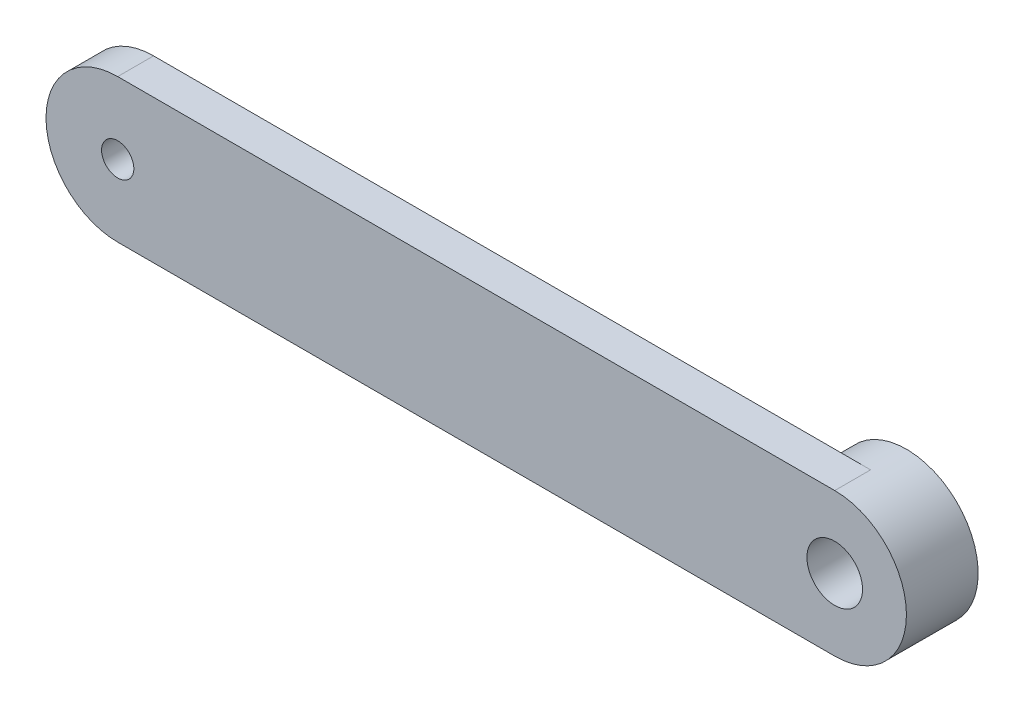
ISO-10303-21;
HEADER;
FILE_DESCRIPTION(('STEP AP214'),'2;1');
FILE_NAME('part.step','',(''),(''),'','','');
FILE_SCHEMA(('AUTOMOTIVE_DESIGN { 1 0 10303 214 1 1 1 1 }'));
ENDSEC;
DATA;
#1=APPLICATION_CONTEXT('core data for automotive mechanical design processes');
#2=APPLICATION_PROTOCOL_DEFINITION('international standard','automotive_design',2000,#1);
#3=PRODUCT_CONTEXT('',#1,'mechanical');
#4=PRODUCT('Part','Part','',(#3));
#5=PRODUCT_RELATED_PRODUCT_CATEGORY('part','',(#4));
#6=PRODUCT_DEFINITION_FORMATION('','',#4);
#7=PRODUCT_DEFINITION_CONTEXT('part definition',#1,'design');
#8=PRODUCT_DEFINITION('design','',#6,#7);
#9=PRODUCT_DEFINITION_SHAPE('','',#8);
#10=(LENGTH_UNIT() NAMED_UNIT(*) SI_UNIT(.MILLI.,.METRE.));
#11=(NAMED_UNIT(*) PLANE_ANGLE_UNIT() SI_UNIT($,.RADIAN.));
#12=(NAMED_UNIT(*) SI_UNIT($,.STERADIAN.) SOLID_ANGLE_UNIT());
#13=UNCERTAINTY_MEASURE_WITH_UNIT(LENGTH_MEASURE(1.E-05),#10,'distance_accuracy_value','');
#14=(GEOMETRIC_REPRESENTATION_CONTEXT(3) GLOBAL_UNCERTAINTY_ASSIGNED_CONTEXT((#13)) GLOBAL_UNIT_ASSIGNED_CONTEXT((#10,
#11,#12)) REPRESENTATION_CONTEXT('',''));
#15=CARTESIAN_POINT('',(0.,0.,0.));
#16=DIRECTION('',(0.,0.,1.));
#17=DIRECTION('',(1.,0.,0.));
#18=AXIS2_PLACEMENT_3D('',#15,#16,#17);
#19=CARTESIAN_POINT('',(20.,0.,0.));
#20=DIRECTION('',(0.,0.,1.));
#21=DIRECTION('',(1.,0.,0.));
#22=AXIS2_PLACEMENT_3D('',#19,#20,#21);
#23=PLANE('',#22);
#24=CARTESIAN_POINT('',(-20.,0.,0.));
#25=DIRECTION('',(0.,0.,1.));
#26=DIRECTION('',(1.,0.,0.));
#27=AXIS2_PLACEMENT_3D('',#24,#25,#26);
#28=CIRCLE('',#27,2.);
#29=CARTESIAN_POINT('',(-18.,0.,0.));
#30=VERTEX_POINT('',#29);
#31=EDGE_CURVE('E12',#30,#30,#28,.F.);
#32=ORIENTED_EDGE('',*,*,#31,.F.);
#33=EDGE_LOOP('',(#32));
#34=FACE_BOUND('',#33,.T.);
#35=CARTESIAN_POINT('',(20.,0.,0.));
#36=DIRECTION('',(0.,0.,-1.));
#37=DIRECTION('',(-1.,0.,0.));
#38=AXIS2_PLACEMENT_3D('',#35,#36,#37);
#39=CIRCLE('',#38,4.);
#40=CARTESIAN_POINT('',(20.,-3.99999999999999,0.));
#41=VERTEX_POINT('',#40);
#42=CARTESIAN_POINT('',(20.,4.00000000000001,0.));
#43=VERTEX_POINT('',#42);
#44=EDGE_CURVE('E89',#41,#43,#39,.T.);
#45=ORIENTED_EDGE('',*,*,#44,.F.);
#46=DIRECTION('',(1.,0.,0.));
#47=VECTOR('',#46,1.);
#48=CARTESIAN_POINT('',(20.,-3.99999999999999,0.));
#49=LINE('',#48,#47);
#50=CARTESIAN_POINT('',(-20.,-4.00000000000001,0.));
#51=VERTEX_POINT('',#50);
#52=EDGE_CURVE('E91',#51,#41,#49,.T.);
#53=ORIENTED_EDGE('',*,*,#52,.F.);
#54=CARTESIAN_POINT('',(-20.,0.,0.));
#55=DIRECTION('',(0.,0.,1.));
#56=DIRECTION('',(1.,0.,0.));
#57=AXIS2_PLACEMENT_3D('',#54,#55,#56);
#58=CIRCLE('',#57,4.);
#59=CARTESIAN_POINT('',(-20.,4.,0.));
#60=VERTEX_POINT('',#59);
#61=EDGE_CURVE('E79',#60,#51,#58,.T.);
#62=ORIENTED_EDGE('',*,*,#61,.F.);
#63=DIRECTION('',(-1.,0.,0.));
#64=VECTOR('',#63,1.);
#65=CARTESIAN_POINT('',(20.,4.00000000000001,0.));
#66=LINE('',#65,#64);
#67=EDGE_CURVE('E72',#43,#60,#66,.T.);
#68=ORIENTED_EDGE('',*,*,#67,.F.);
#69=EDGE_LOOP('',(#45,#53,#62,#68));
#70=FACE_BOUND('',#69,.T.);
#71=ADVANCED_FACE('F40',(#34,#70),#23,.F.);
#72=CARTESIAN_POINT('',(20.,0.,2.));
#73=DIRECTION('',(0.,0.,1.));
#74=DIRECTION('',(1.,0.,0.));
#75=AXIS2_PLACEMENT_3D('',#72,#73,#74);
#76=PLANE('',#75);
#77=CARTESIAN_POINT('',(20.,0.,2.));
#78=DIRECTION('',(0.,0.,1.));
#79=DIRECTION('',(1.,0.,0.));
#80=AXIS2_PLACEMENT_3D('',#77,#78,#79);
#81=CIRCLE('',#80,1.55);
#82=CARTESIAN_POINT('',(21.55,0.,2.));
#83=VERTEX_POINT('',#82);
#84=EDGE_CURVE('E178',#83,#83,#81,.T.);
#85=ORIENTED_EDGE('',*,*,#84,.F.);
#86=EDGE_LOOP('',(#85));
#87=FACE_BOUND('',#86,.T.);
#88=CARTESIAN_POINT('',(20.,0.,2.));
#89=DIRECTION('',(0.,0.,1.));
#90=DIRECTION('',(1.,0.,0.));
#91=AXIS2_PLACEMENT_3D('',#88,#89,#90);
#92=CIRCLE('',#91,4.);
#93=CARTESIAN_POINT('',(20.,-3.99999999999999,2.));
#94=VERTEX_POINT('',#93);
#95=CARTESIAN_POINT('',(20.,4.00000000000001,2.));
#96=VERTEX_POINT('',#95);
#97=EDGE_CURVE('E103',#94,#96,#92,.T.);
#98=ORIENTED_EDGE('',*,*,#97,.T.);
#99=DIRECTION('',(-1.,0.,0.));
#100=VECTOR('',#99,1.);
#101=CARTESIAN_POINT('',(20.,4.00000000000001,2.));
#102=LINE('',#101,#100);
#103=CARTESIAN_POINT('',(-20.,4.,2.));
#104=VERTEX_POINT('',#103);
#105=EDGE_CURVE('E84',#96,#104,#102,.T.);
#106=ORIENTED_EDGE('',*,*,#105,.T.);
#107=CARTESIAN_POINT('',(-20.,0.,2.));
#108=DIRECTION('',(0.,0.,1.));
#109=DIRECTION('',(1.,0.,0.));
#110=AXIS2_PLACEMENT_3D('',#107,#108,#109);
#111=CIRCLE('',#110,4.);
#112=CARTESIAN_POINT('',(-20.,-4.00000000000001,2.));
#113=VERTEX_POINT('',#112);
#114=EDGE_CURVE('E109',#104,#113,#111,.T.);
#115=ORIENTED_EDGE('',*,*,#114,.T.);
#116=DIRECTION('',(1.,0.,0.));
#117=VECTOR('',#116,1.);
#118=CARTESIAN_POINT('',(20.,-3.99999999999999,2.));
#119=LINE('',#118,#117);
#120=EDGE_CURVE('E57',#113,#94,#119,.T.);
#121=ORIENTED_EDGE('',*,*,#120,.T.);
#122=EDGE_LOOP('',(#98,#106,#115,#121));
#123=FACE_BOUND('',#122,.T.);
#124=CARTESIAN_POINT('',(-20.,0.,2.));
#125=DIRECTION('',(0.,0.,1.));
#126=DIRECTION('',(1.,0.,0.));
#127=AXIS2_PLACEMENT_3D('',#124,#125,#126);
#128=CIRCLE('',#127,0.9);
#129=CARTESIAN_POINT('',(-19.1,0.,2.));
#130=VERTEX_POINT('',#129);
#131=EDGE_CURVE('E175',#130,#130,#128,.T.);
#132=ORIENTED_EDGE('',*,*,#131,.F.);
#133=EDGE_LOOP('',(#132));
#134=FACE_BOUND('',#133,.T.);
#135=ADVANCED_FACE('F121',(#87,#123,#134),#76,.T.);
#136=CARTESIAN_POINT('',(20.,0.,2.));
#137=DIRECTION('',(0.,0.,-1.));
#138=DIRECTION('',(-1.,0.,0.));
#139=AXIS2_PLACEMENT_3D('',#136,#137,#138);
#140=CYLINDRICAL_SURFACE('',#139,4.);
#141=DIRECTION('',(0.,0.,-1.));
#142=VECTOR('',#141,1.);
#143=CARTESIAN_POINT('',(20.,-3.99999999999999,2.));
#144=LINE('',#143,#142);
#145=EDGE_CURVE('E100',#94,#41,#144,.T.);
#146=ORIENTED_EDGE('',*,*,#145,.T.);
#147=ORIENTED_EDGE('',*,*,#44,.T.);
#148=DIRECTION('',(0.,0.,-1.));
#149=VECTOR('',#148,1.);
#150=CARTESIAN_POINT('',(20.,4.00000000000001,2.));
#151=LINE('',#150,#149);
#152=EDGE_CURVE('E49',#96,#43,#151,.T.);
#153=ORIENTED_EDGE('',*,*,#152,.F.);
#154=ORIENTED_EDGE('',*,*,#97,.F.);
#155=EDGE_LOOP('',(#146,#147,#153,#154));
#156=FACE_BOUND('',#155,.T.);
#157=CARTESIAN_POINT('',(20.,0.,-2.));
#158=DIRECTION('',(0.,0.,-1.));
#159=DIRECTION('',(-1.,0.,0.));
#160=AXIS2_PLACEMENT_3D('',#157,#158,#159);
#161=CIRCLE('',#160,4.);
#162=CARTESIAN_POINT('',(16.,0.,-2.));
#163=VERTEX_POINT('',#162);
#164=EDGE_CURVE('E95',#163,#163,#161,.T.);
#165=ORIENTED_EDGE('',*,*,#164,.F.);
#166=EDGE_LOOP('',(#165));
#167=FACE_BOUND('',#166,.T.);
#168=ADVANCED_FACE('F42',(#156,#167),#140,.T.);
#169=CARTESIAN_POINT('',(20.,4.00000000000001,2.));
#170=DIRECTION('',(0.,-1.,0.));
#171=DIRECTION('',(1.,0.,0.));
#172=AXIS2_PLACEMENT_3D('',#169,#170,#171);
#173=PLANE('',#172);
#174=ORIENTED_EDGE('',*,*,#67,.T.);
#175=DIRECTION('',(0.,0.,-1.));
#176=VECTOR('',#175,1.);
#177=CARTESIAN_POINT('',(-20.,4.,2.));
#178=LINE('',#177,#176);
#179=EDGE_CURVE('E107',#104,#60,#178,.T.);
#180=ORIENTED_EDGE('',*,*,#179,.F.);
#181=ORIENTED_EDGE('',*,*,#105,.F.);
#182=ORIENTED_EDGE('',*,*,#152,.T.);
#183=EDGE_LOOP('',(#174,#180,#181,#182));
#184=FACE_BOUND('',#183,.T.);
#185=ADVANCED_FACE('F113',(#184),#173,.F.);
#186=CARTESIAN_POINT('',(-20.,0.,2.));
#187=DIRECTION('',(0.,0.,-1.));
#188=DIRECTION('',(-1.,0.,0.));
#189=AXIS2_PLACEMENT_3D('',#186,#187,#188);
#190=CYLINDRICAL_SURFACE('',#189,4.);
#191=ORIENTED_EDGE('',*,*,#61,.T.);
#192=DIRECTION('',(0.,0.,-1.));
#193=VECTOR('',#192,1.);
#194=CARTESIAN_POINT('',(-20.,-4.00000000000001,2.));
#195=LINE('',#194,#193);
#196=EDGE_CURVE('E102',#113,#51,#195,.T.);
#197=ORIENTED_EDGE('',*,*,#196,.F.);
#198=ORIENTED_EDGE('',*,*,#114,.F.);
#199=ORIENTED_EDGE('',*,*,#179,.T.);
#200=EDGE_LOOP('',(#191,#197,#198,#199));
#201=FACE_BOUND('',#200,.T.);
#202=ADVANCED_FACE('F115',(#201),#190,.T.);
#203=CARTESIAN_POINT('',(20.,-3.99999999999999,2.));
#204=DIRECTION('',(0.,1.,0.));
#205=DIRECTION('',(-1.,0.,0.));
#206=AXIS2_PLACEMENT_3D('',#203,#204,#205);
#207=PLANE('',#206);
#208=ORIENTED_EDGE('',*,*,#52,.T.);
#209=ORIENTED_EDGE('',*,*,#145,.F.);
#210=ORIENTED_EDGE('',*,*,#120,.F.);
#211=ORIENTED_EDGE('',*,*,#196,.T.);
#212=EDGE_LOOP('',(#208,#209,#210,#211));
#213=FACE_BOUND('',#212,.T.);
#214=ADVANCED_FACE('F99',(#213),#207,.F.);
#215=CARTESIAN_POINT('',(20.,0.,2.));
#216=DIRECTION('',(0.,0.,-1.));
#217=DIRECTION('',(-1.,0.,0.));
#218=AXIS2_PLACEMENT_3D('',#215,#216,#217);
#219=CYLINDRICAL_SURFACE('',#218,1.55);
#220=ORIENTED_EDGE('',*,*,#84,.T.);
#221=EDGE_LOOP('',(#220));
#222=FACE_BOUND('',#221,.T.);
#223=CARTESIAN_POINT('',(20.,0.,-2.));
#224=DIRECTION('',(0.,0.,-1.));
#225=DIRECTION('',(-1.,0.,0.));
#226=AXIS2_PLACEMENT_3D('',#223,#224,#225);
#227=CIRCLE('',#226,1.55);
#228=CARTESIAN_POINT('',(18.45,0.,-2.));
#229=VERTEX_POINT('',#228);
#230=EDGE_CURVE('E96',#229,#229,#227,.T.);
#231=ORIENTED_EDGE('',*,*,#230,.T.);
#232=EDGE_LOOP('',(#231));
#233=FACE_BOUND('',#232,.T.);
#234=ADVANCED_FACE('F134',(#222,#233),#219,.F.);
#235=CARTESIAN_POINT('',(-20.,0.,2.));
#236=DIRECTION('',(0.,0.,-1.));
#237=DIRECTION('',(-1.,0.,0.));
#238=AXIS2_PLACEMENT_3D('',#235,#236,#237);
#239=CYLINDRICAL_SURFACE('',#238,0.9);
#240=ORIENTED_EDGE('',*,*,#131,.T.);
#241=EDGE_LOOP('',(#240));
#242=FACE_BOUND('',#241,.T.);
#243=CARTESIAN_POINT('',(-20.,0.,-2.));
#244=DIRECTION('',(0.,0.,-1.));
#245=DIRECTION('',(-1.,0.,0.));
#246=AXIS2_PLACEMENT_3D('',#243,#244,#245);
#247=CIRCLE('',#246,0.9);
#248=CARTESIAN_POINT('',(-20.9,0.,-2.));
#249=VERTEX_POINT('',#248);
#250=EDGE_CURVE('E168',#249,#249,#247,.T.);
#251=ORIENTED_EDGE('',*,*,#250,.T.);
#252=EDGE_LOOP('',(#251));
#253=FACE_BOUND('',#252,.T.);
#254=ADVANCED_FACE('F138',(#242,#253),#239,.F.);
#255=CARTESIAN_POINT('',(-20.,0.,-2.));
#256=DIRECTION('',(0.,0.,-1.));
#257=DIRECTION('',(-1.,0.,0.));
#258=AXIS2_PLACEMENT_3D('',#255,#256,#257);
#259=PLANE('',#258);
#260=CARTESIAN_POINT('',(-20.,0.,-2.));
#261=DIRECTION('',(0.,0.,-1.));
#262=DIRECTION('',(-1.,0.,0.));
#263=AXIS2_PLACEMENT_3D('',#260,#261,#262);
#264=CIRCLE('',#263,2.);
#265=CARTESIAN_POINT('',(-22.,0.,-2.));
#266=VERTEX_POINT('',#265);
#267=EDGE_CURVE('E172',#266,#266,#264,.T.);
#268=ORIENTED_EDGE('',*,*,#267,.T.);
#269=EDGE_LOOP('',(#268));
#270=FACE_BOUND('',#269,.T.);
#271=ORIENTED_EDGE('',*,*,#250,.F.);
#272=EDGE_LOOP('',(#271));
#273=FACE_BOUND('',#272,.T.);
#274=ADVANCED_FACE('F143',(#270,#273),#259,.T.);
#275=CARTESIAN_POINT('',(-20.,0.,-2.));
#276=DIRECTION('',(0.,0.,1.));
#277=DIRECTION('',(1.,0.,0.));
#278=AXIS2_PLACEMENT_3D('',#275,#276,#277);
#279=CYLINDRICAL_SURFACE('',#278,2.);
#280=ORIENTED_EDGE('',*,*,#267,.F.);
#281=EDGE_LOOP('',(#280));
#282=FACE_BOUND('',#281,.T.);
#283=ORIENTED_EDGE('',*,*,#31,.T.);
#284=EDGE_LOOP('',(#283));
#285=FACE_BOUND('',#284,.T.);
#286=ADVANCED_FACE('F149',(#282,#285),#279,.T.);
#287=CARTESIAN_POINT('',(20.,0.,-2.));
#288=DIRECTION('',(0.,0.,-1.));
#289=DIRECTION('',(-1.,0.,0.));
#290=AXIS2_PLACEMENT_3D('',#287,#288,#289);
#291=PLANE('',#290);
#292=ORIENTED_EDGE('',*,*,#164,.T.);
#293=EDGE_LOOP('',(#292));
#294=FACE_BOUND('',#293,.T.);
#295=ORIENTED_EDGE('',*,*,#230,.F.);
#296=EDGE_LOOP('',(#295));
#297=FACE_BOUND('',#296,.T.);
#298=ADVANCED_FACE('F152',(#294,#297),#291,.T.);
#299=CLOSED_SHELL('',(#71,#135,#168,#185,#202,#214,#234,#254,#274,#286,#298));
#300=MANIFOLD_SOLID_BREP('B2',#299);
#301=ADVANCED_BREP_SHAPE_REPRESENTATION('',(#18,#300),#14);
#302=SHAPE_DEFINITION_REPRESENTATION(#9,#301);
ENDSEC;
END-ISO-10303-21;
